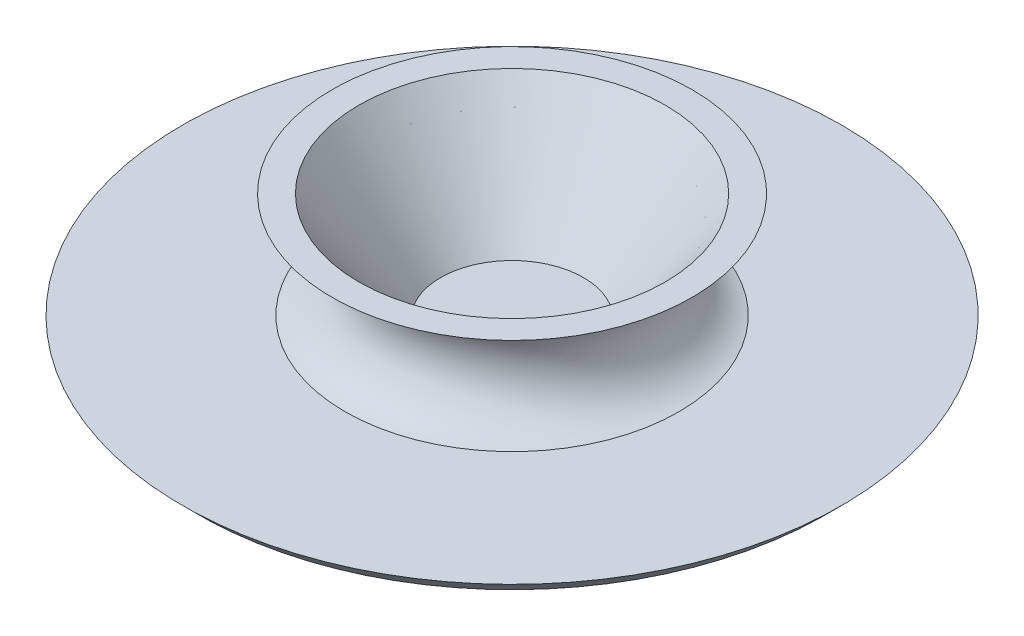
ISO-10303-21;
HEADER;
FILE_DESCRIPTION(('STEP AP214'),'2;1');
FILE_NAME('part.step','',(''),(''),'','','');
FILE_SCHEMA(('AUTOMOTIVE_DESIGN { 1 0 10303 214 1 1 1 1 }'));
ENDSEC;
DATA;
#1=APPLICATION_CONTEXT('core data for automotive mechanical design processes');
#2=APPLICATION_PROTOCOL_DEFINITION('international standard','automotive_design',2000,#1);
#3=PRODUCT_CONTEXT('',#1,'mechanical');
#4=PRODUCT('Part','Part','',(#3));
#5=PRODUCT_RELATED_PRODUCT_CATEGORY('part','',(#4));
#6=PRODUCT_DEFINITION_FORMATION('','',#4);
#7=PRODUCT_DEFINITION_CONTEXT('part definition',#1,'design');
#8=PRODUCT_DEFINITION('design','',#6,#7);
#9=PRODUCT_DEFINITION_SHAPE('','',#8);
#10=(LENGTH_UNIT() NAMED_UNIT(*) SI_UNIT(.MILLI.,.METRE.));
#11=(NAMED_UNIT(*) PLANE_ANGLE_UNIT() SI_UNIT($,.RADIAN.));
#12=(NAMED_UNIT(*) SI_UNIT($,.STERADIAN.) SOLID_ANGLE_UNIT());
#13=UNCERTAINTY_MEASURE_WITH_UNIT(LENGTH_MEASURE(1.E-05),#10,'distance_accuracy_value','');
#14=(GEOMETRIC_REPRESENTATION_CONTEXT(3) GLOBAL_UNCERTAINTY_ASSIGNED_CONTEXT((#13)) GLOBAL_UNIT_ASSIGNED_CONTEXT((#10,
#11,#12)) REPRESENTATION_CONTEXT('',''));
#15=CARTESIAN_POINT('',(0.,0.,0.));
#16=DIRECTION('',(0.,0.,1.));
#17=DIRECTION('',(1.,0.,0.));
#18=AXIS2_PLACEMENT_3D('',#15,#16,#17);
#19=CARTESIAN_POINT('',(0.,0.,0.));
#20=DIRECTION('',(0.,1.,0.));
#21=DIRECTION('',(0.,0.,1.));
#22=AXIS2_PLACEMENT_3D('',#19,#20,#21);
#23=PLANE('',#22);
#24=CARTESIAN_POINT('',(0.,-1.65232411086791E-13,0.));
#25=DIRECTION('',(0.,-1.,0.));
#26=DIRECTION('',(0.,0.,-1.));
#27=AXIS2_PLACEMENT_3D('',#24,#25,#26);
#28=CIRCLE('',#27,23.6683795820487);
#29=CARTESIAN_POINT('',(0.,-1.65232411086791E-13,-23.6683795820487));
#30=VERTEX_POINT('',#29);
#31=EDGE_CURVE('E50',#30,#30,#28,.T.);
#32=ORIENTED_EDGE('',*,*,#31,.T.);
#33=EDGE_LOOP('',(#32));
#34=FACE_BOUND('',#33,.T.);
#35=ADVANCED_FACE('F43',(#34),#23,.F.);
#36=CARTESIAN_POINT('',(0.,4.16147333310724,0.));
#37=DIRECTION('',(0.,1.,0.));
#38=DIRECTION('',(0.,0.,1.));
#39=AXIS2_PLACEMENT_3D('',#36,#37,#38);
#40=CONICAL_SURFACE('',#39,27.8298529151564,0.785398163397483);
#41=ORIENTED_EDGE('',*,*,#31,.F.);
#42=EDGE_LOOP('',(#41));
#43=FACE_BOUND('',#42,.T.);
#44=CARTESIAN_POINT('',(0.,4.16147333310724,0.));
#45=DIRECTION('',(0.,-1.,0.));
#46=DIRECTION('',(0.,0.,-1.));
#47=AXIS2_PLACEMENT_3D('',#44,#45,#46);
#48=CIRCLE('',#47,27.8298529151564);
#49=CARTESIAN_POINT('',(0.,4.16147333310724,-27.8298529151564));
#50=VERTEX_POINT('',#49);
#51=EDGE_CURVE('E55',#50,#50,#48,.T.);
#52=ORIENTED_EDGE('',*,*,#51,.T.);
#53=EDGE_LOOP('',(#52));
#54=FACE_BOUND('',#53,.T.);
#55=ADVANCED_FACE('F102',(#43,#54),#40,.T.);
#56=CARTESIAN_POINT('',(-27.8298529151564,4.16147333310724,0.));
#57=DIRECTION('',(0.,1.,0.));
#58=DIRECTION('',(0.,0.,1.));
#59=AXIS2_PLACEMENT_3D('',#56,#57,#58);
#60=PLANE('',#59);
#61=ORIENTED_EDGE('',*,*,#51,.F.);
#62=EDGE_LOOP('',(#61));
#63=FACE_BOUND('',#62,.T.);
#64=CARTESIAN_POINT('',(0.,4.16147333310724,0.));
#65=DIRECTION('',(0.,-1.,0.));
#66=DIRECTION('',(0.,0.,-1.));
#67=AXIS2_PLACEMENT_3D('',#64,#65,#66);
#68=CIRCLE('',#67,72.305599162742);
#69=CARTESIAN_POINT('',(0.,4.16147333310724,-72.305599162742));
#70=VERTEX_POINT('',#69);
#71=EDGE_CURVE('E60',#70,#70,#68,.T.);
#72=ORIENTED_EDGE('',*,*,#71,.T.);
#73=EDGE_LOOP('',(#72));
#74=FACE_BOUND('',#73,.T.);
#75=ADVANCED_FACE('F106',(#63,#74),#60,.F.);
#76=CARTESIAN_POINT('',(0.,7.80276249957623,0.));
#77=DIRECTION('',(0.,1.,0.));
#78=DIRECTION('',(0.,0.,1.));
#79=AXIS2_PLACEMENT_3D('',#76,#77,#78);
#80=CONICAL_SURFACE('',#79,75.9468883292113,0.785398163397482);
#81=ORIENTED_EDGE('',*,*,#71,.F.);
#82=EDGE_LOOP('',(#81));
#83=FACE_BOUND('',#82,.T.);
#84=CARTESIAN_POINT('',(0.,7.80276249957623,0.));
#85=DIRECTION('',(0.,-1.,0.));
#86=DIRECTION('',(0.,0.,-1.));
#87=AXIS2_PLACEMENT_3D('',#84,#85,#86);
#88=CIRCLE('',#87,75.9468883292113);
#89=CARTESIAN_POINT('',(0.,7.80276249957623,-75.9468883292113));
#90=VERTEX_POINT('',#89);
#91=EDGE_CURVE('E66',#90,#90,#88,.T.);
#92=ORIENTED_EDGE('',*,*,#91,.T.);
#93=EDGE_LOOP('',(#92));
#94=FACE_BOUND('',#93,.T.);
#95=ADVANCED_FACE('F98',(#83,#94),#80,.T.);
#96=CARTESIAN_POINT('',(-75.9468883292113,7.80276249957623,0.));
#97=DIRECTION('',(0.,-1.,0.));
#98=DIRECTION('',(0.,0.,-1.));
#99=AXIS2_PLACEMENT_3D('',#96,#97,#98);
#100=PLANE('',#99);
#101=CARTESIAN_POINT('',(0.,7.80276249957623,0.));
#102=DIRECTION('',(0.,1.,0.));
#103=DIRECTION('',(0.,0.,1.));
#104=AXIS2_PLACEMENT_3D('',#101,#102,#103);
#105=CIRCLE('',#104,38.4914513620721);
#106=CARTESIAN_POINT('',(0.,7.80276249957623,38.4914513620721));
#107=VERTEX_POINT('',#106);
#108=EDGE_CURVE('E10',#107,#107,#105,.T.);
#109=ORIENTED_EDGE('',*,*,#108,.F.);
#110=EDGE_LOOP('',(#109));
#111=FACE_BOUND('',#110,.T.);
#112=ORIENTED_EDGE('',*,*,#91,.F.);
#113=EDGE_LOOP('',(#112));
#114=FACE_BOUND('',#113,.T.);
#115=ADVANCED_FACE('F93',(#111,#114),#100,.F.);
#116=CARTESIAN_POINT('',(0.,19.7692856888463,0.));
#117=DIRECTION('',(0.,-1.,0.));
#118=DIRECTION('',(0.,0.,-1.));
#119=AXIS2_PLACEMENT_3D('',#116,#117,#118);
#120=TOROIDAL_SURFACE('',#119,41.4765026921919,12.333215666759);
#121=ORIENTED_EDGE('',*,*,#108,.T.);
#122=EDGE_LOOP('',(#121));
#123=FACE_BOUND('',#122,.T.);
#124=CARTESIAN_POINT('',(0.,32.1025013556053,0.));
#125=DIRECTION('',(0.,-1.,0.));
#126=DIRECTION('',(0.,0.,-1.));
#127=AXIS2_PLACEMENT_3D('',#124,#125,#126);
#128=CIRCLE('',#127,41.4765026921919);
#129=CARTESIAN_POINT('',(0.,32.1025013556053,-41.4765026921919));
#130=VERTEX_POINT('',#129);
#131=EDGE_CURVE('E70',#130,#130,#128,.T.);
#132=ORIENTED_EDGE('',*,*,#131,.T.);
#133=EDGE_LOOP('',(#132));
#134=FACE_BOUND('',#133,.T.);
#135=ADVANCED_FACE('F88',(#123,#134),#120,.F.);
#136=CARTESIAN_POINT('',(-41.4765026921919,32.1025013556053,0.));
#137=DIRECTION('',(0.,-1.,0.));
#138=DIRECTION('',(0.,0.,-1.));
#139=AXIS2_PLACEMENT_3D('',#136,#137,#138);
#140=PLANE('',#139);
#141=CARTESIAN_POINT('',(0.,32.1025013556053,0.));
#142=DIRECTION('',(0.,1.,0.));
#143=DIRECTION('',(0.,0.,1.));
#144=AXIS2_PLACEMENT_3D('',#141,#142,#143);
#145=CIRCLE('',#144,35.3044966728283);
#146=CARTESIAN_POINT('',(0.,32.1025013556053,35.3044966728283));
#147=VERTEX_POINT('',#146);
#148=EDGE_CURVE('E78',#147,#147,#145,.T.);
#149=ORIENTED_EDGE('',*,*,#148,.F.);
#150=EDGE_LOOP('',(#149));
#151=FACE_BOUND('',#150,.T.);
#152=ORIENTED_EDGE('',*,*,#131,.F.);
#153=EDGE_LOOP('',(#152));
#154=FACE_BOUND('',#153,.T.);
#155=ADVANCED_FACE('F85',(#151,#154),#140,.F.);
#156=CARTESIAN_POINT('',(0.,32.1025013556053,0.));
#157=DIRECTION('',(0.,1.,0.));
#158=DIRECTION('',(0.,0.,1.));
#159=AXIS2_PLACEMENT_3D('',#156,#157,#158);
#160=CONICAL_SURFACE('',#159,35.3044966728283,0.645771823237903);
#161=CARTESIAN_POINT('',(0.,7.10250135560529,0.));
#162=DIRECTION('',(0.,1.,0.));
#163=DIRECTION('',(0.,0.,1.));
#164=AXIS2_PLACEMENT_3D('',#161,#162,#163);
#165=CIRCLE('',#164,16.4656454202584);
#166=CARTESIAN_POINT('',(0.,7.10250135560529,16.4656454202584));
#167=VERTEX_POINT('',#166);
#168=EDGE_CURVE('E74',#167,#167,#165,.T.);
#169=ORIENTED_EDGE('',*,*,#168,.F.);
#170=EDGE_LOOP('',(#169));
#171=FACE_BOUND('',#170,.T.);
#172=ORIENTED_EDGE('',*,*,#148,.T.);
#173=EDGE_LOOP('',(#172));
#174=FACE_BOUND('',#173,.T.);
#175=ADVANCED_FACE('F83',(#171,#174),#160,.F.);
#176=CARTESIAN_POINT('',(0.,7.10250135560529,0.));
#177=DIRECTION('',(0.,1.,0.));
#178=DIRECTION('',(0.,0.,1.));
#179=AXIS2_PLACEMENT_3D('',#176,#177,#178);
#180=PLANE('',#179);
#181=ORIENTED_EDGE('',*,*,#168,.T.);
#182=EDGE_LOOP('',(#181));
#183=FACE_BOUND('',#182,.T.);
#184=ADVANCED_FACE('F156',(#183),#180,.T.);
#185=CLOSED_SHELL('',(#35,#55,#75,#95,#115,#135,#155,#175,#184));
#186=MANIFOLD_SOLID_BREP('B2',#185);
#187=ADVANCED_BREP_SHAPE_REPRESENTATION('',(#18,#186),#14);
#188=SHAPE_DEFINITION_REPRESENTATION(#9,#187);
ENDSEC;
END-ISO-10303-21;
